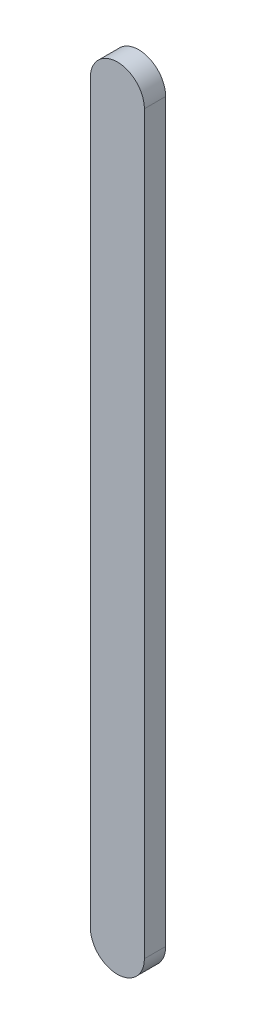
ISO-10303-21;
HEADER;
FILE_DESCRIPTION(('STEP AP214'),'2;1');
FILE_NAME('part.step','',(''),(''),'','','');
FILE_SCHEMA(('AUTOMOTIVE_DESIGN { 1 0 10303 214 1 1 1 1 }'));
ENDSEC;
DATA;
#1=APPLICATION_CONTEXT('core data for automotive mechanical design processes');
#2=APPLICATION_PROTOCOL_DEFINITION('international standard','automotive_design',2000,#1);
#3=PRODUCT_CONTEXT('',#1,'mechanical');
#4=PRODUCT('Part','Part','',(#3));
#5=PRODUCT_RELATED_PRODUCT_CATEGORY('part','',(#4));
#6=PRODUCT_DEFINITION_FORMATION('','',#4);
#7=PRODUCT_DEFINITION_CONTEXT('part definition',#1,'design');
#8=PRODUCT_DEFINITION('design','',#6,#7);
#9=PRODUCT_DEFINITION_SHAPE('','',#8);
#10=(LENGTH_UNIT() NAMED_UNIT(*) SI_UNIT(.MILLI.,.METRE.));
#11=(NAMED_UNIT(*) PLANE_ANGLE_UNIT() SI_UNIT($,.RADIAN.));
#12=(NAMED_UNIT(*) SI_UNIT($,.STERADIAN.) SOLID_ANGLE_UNIT());
#13=UNCERTAINTY_MEASURE_WITH_UNIT(LENGTH_MEASURE(1.E-05),#10,'distance_accuracy_value','');
#14=(GEOMETRIC_REPRESENTATION_CONTEXT(3) GLOBAL_UNCERTAINTY_ASSIGNED_CONTEXT((#13)) GLOBAL_UNIT_ASSIGNED_CONTEXT((#10,
#11,#12)) REPRESENTATION_CONTEXT('',''));
#15=CARTESIAN_POINT('',(0.,0.,0.));
#16=DIRECTION('',(0.,0.,1.));
#17=DIRECTION('',(1.,0.,0.));
#18=AXIS2_PLACEMENT_3D('',#15,#16,#17);
#19=CARTESIAN_POINT('',(96.012,66.86363056,0.));
#20=DIRECTION('',(-1.,0.,0.));
#21=DIRECTION('',(0.,1.,0.));
#22=AXIS2_PLACEMENT_3D('',#19,#20,#21);
#23=PLANE('',#22);
#24=DIRECTION('',(0.,1.,0.));
#25=VECTOR('',#24,1.);
#26=CARTESIAN_POINT('',(96.012,66.86363056,0.1999996));
#27=LINE('',#26,#25);
#28=CARTESIAN_POINT('',(96.012,66.86363056,0.1999996));
#29=VERTEX_POINT('',#28);
#30=CARTESIAN_POINT('',(96.012,73.7840028,0.1999996));
#31=VERTEX_POINT('',#30);
#32=EDGE_CURVE('E11',#29,#31,#27,.T.);
#33=ORIENTED_EDGE('',*,*,#32,.F.);
#34=DIRECTION('',(0.,0.,1.));
#35=VECTOR('',#34,1.);
#36=CARTESIAN_POINT('',(96.012,66.86363056,0.));
#37=LINE('',#36,#35);
#38=CARTESIAN_POINT('',(96.012,66.86363056,0.));
#39=VERTEX_POINT('',#38);
#40=EDGE_CURVE('E24',#39,#29,#37,.T.);
#41=ORIENTED_EDGE('',*,*,#40,.F.);
#42=DIRECTION('',(0.,1.,0.));
#43=VECTOR('',#42,1.);
#44=CARTESIAN_POINT('',(96.012,66.86363056,0.));
#45=LINE('',#44,#43);
#46=CARTESIAN_POINT('',(96.012,73.7840028,0.));
#47=VERTEX_POINT('',#46);
#48=EDGE_CURVE('E75',#39,#47,#45,.T.);
#49=ORIENTED_EDGE('',*,*,#48,.T.);
#50=DIRECTION('',(0.,0.,1.));
#51=VECTOR('',#50,1.);
#52=CARTESIAN_POINT('',(96.012,73.7840028,0.));
#53=LINE('',#52,#51);
#54=EDGE_CURVE('E37',#47,#31,#53,.T.);
#55=ORIENTED_EDGE('',*,*,#54,.T.);
#56=EDGE_LOOP('',(#33,#41,#49,#55));
#57=FACE_BOUND('',#56,.T.);
#58=ADVANCED_FACE('F17',(#57),#23,.F.);
#59=CARTESIAN_POINT('',(95.758,73.7840028,0.));
#60=DIRECTION('',(0.,0.,-1.));
#61=DIRECTION('',(1.,0.,0.));
#62=AXIS2_PLACEMENT_3D('',#59,#60,#61);
#63=CYLINDRICAL_SURFACE('',#62,0.253999999999995);
#64=CARTESIAN_POINT('',(95.758,73.7840028,0.1999996));
#65=DIRECTION('',(0.,0.,1.));
#66=DIRECTION('',(1.,0.,0.));
#67=AXIS2_PLACEMENT_3D('',#64,#65,#66);
#68=CIRCLE('',#67,0.253999999999995);
#69=CARTESIAN_POINT('',(95.504,73.7840028,0.1999996));
#70=VERTEX_POINT('',#69);
#71=EDGE_CURVE('E83',#31,#70,#68,.T.);
#72=ORIENTED_EDGE('',*,*,#71,.F.);
#73=ORIENTED_EDGE('',*,*,#54,.F.);
#74=CARTESIAN_POINT('',(95.758,73.7840028,0.));
#75=DIRECTION('',(0.,0.,1.));
#76=DIRECTION('',(1.,0.,0.));
#77=AXIS2_PLACEMENT_3D('',#74,#75,#76);
#78=CIRCLE('',#77,0.253999999999995);
#79=CARTESIAN_POINT('',(95.504,73.7840028,0.));
#80=VERTEX_POINT('',#79);
#81=EDGE_CURVE('E81',#47,#80,#78,.T.);
#82=ORIENTED_EDGE('',*,*,#81,.T.);
#83=DIRECTION('',(0.,0.,1.));
#84=VECTOR('',#83,1.);
#85=CARTESIAN_POINT('',(95.504,73.7840028,0.));
#86=LINE('',#85,#84);
#87=EDGE_CURVE('E67',#80,#70,#86,.T.);
#88=ORIENTED_EDGE('',*,*,#87,.T.);
#89=EDGE_LOOP('',(#72,#73,#82,#88));
#90=FACE_BOUND('',#89,.T.);
#91=ADVANCED_FACE('F89',(#90),#63,.T.);
#92=CARTESIAN_POINT('',(95.504,73.7840028,0.));
#93=DIRECTION('',(1.,0.,0.));
#94=DIRECTION('',(0.,-1.,0.));
#95=AXIS2_PLACEMENT_3D('',#92,#93,#94);
#96=PLANE('',#95);
#97=DIRECTION('',(0.,-1.,0.));
#98=VECTOR('',#97,1.);
#99=CARTESIAN_POINT('',(95.504,73.7840028,0.1999996));
#100=LINE('',#99,#98);
#101=CARTESIAN_POINT('',(95.504,66.86363056,0.1999996));
#102=VERTEX_POINT('',#101);
#103=EDGE_CURVE('E71',#70,#102,#100,.T.);
#104=ORIENTED_EDGE('',*,*,#103,.F.);
#105=ORIENTED_EDGE('',*,*,#87,.F.);
#106=DIRECTION('',(0.,-1.,0.));
#107=VECTOR('',#106,1.);
#108=CARTESIAN_POINT('',(95.504,73.7840028,0.));
#109=LINE('',#108,#107);
#110=CARTESIAN_POINT('',(95.504,66.86363056,0.));
#111=VERTEX_POINT('',#110);
#112=EDGE_CURVE('E63',#80,#111,#109,.T.);
#113=ORIENTED_EDGE('',*,*,#112,.T.);
#114=DIRECTION('',(0.,0.,1.));
#115=VECTOR('',#114,1.);
#116=CARTESIAN_POINT('',(95.504,66.86363056,0.));
#117=LINE('',#116,#115);
#118=EDGE_CURVE('E53',#111,#102,#117,.T.);
#119=ORIENTED_EDGE('',*,*,#118,.T.);
#120=EDGE_LOOP('',(#104,#105,#113,#119));
#121=FACE_BOUND('',#120,.T.);
#122=ADVANCED_FACE('F66',(#121),#96,.F.);
#123=CARTESIAN_POINT('',(95.758,66.86363056,0.));
#124=DIRECTION('',(0.,0.,-1.));
#125=DIRECTION('',(-1.,0.,0.));
#126=AXIS2_PLACEMENT_3D('',#123,#124,#125);
#127=CYLINDRICAL_SURFACE('',#126,0.253999999999995);
#128=CARTESIAN_POINT('',(95.758,66.86363056,0.1999996));
#129=DIRECTION('',(0.,0.,1.));
#130=DIRECTION('',(-1.,0.,0.));
#131=AXIS2_PLACEMENT_3D('',#128,#129,#130);
#132=CIRCLE('',#131,0.253999999999995);
#133=EDGE_CURVE('E59',#102,#29,#132,.T.);
#134=ORIENTED_EDGE('',*,*,#133,.F.);
#135=ORIENTED_EDGE('',*,*,#118,.F.);
#136=CARTESIAN_POINT('',(95.758,66.86363056,0.));
#137=DIRECTION('',(0.,0.,1.));
#138=DIRECTION('',(-1.,0.,0.));
#139=AXIS2_PLACEMENT_3D('',#136,#137,#138);
#140=CIRCLE('',#139,0.253999999999995);
#141=EDGE_CURVE('E57',#111,#39,#140,.T.);
#142=ORIENTED_EDGE('',*,*,#141,.T.);
#143=ORIENTED_EDGE('',*,*,#40,.T.);
#144=EDGE_LOOP('',(#134,#135,#142,#143));
#145=FACE_BOUND('',#144,.T.);
#146=ADVANCED_FACE('F55',(#145),#127,.T.);
#147=CARTESIAN_POINT('',(96.012,66.86363056,0.));
#148=DIRECTION('',(0.,0.,-1.));
#149=DIRECTION('',(-1.,0.,0.));
#150=AXIS2_PLACEMENT_3D('',#147,#148,#149);
#151=PLANE('',#150);
#152=ORIENTED_EDGE('',*,*,#141,.F.);
#153=ORIENTED_EDGE('',*,*,#112,.F.);
#154=ORIENTED_EDGE('',*,*,#81,.F.);
#155=ORIENTED_EDGE('',*,*,#48,.F.);
#156=EDGE_LOOP('',(#152,#153,#154,#155));
#157=FACE_BOUND('',#156,.T.);
#158=ADVANCED_FACE('F74',(#157),#151,.T.);
#159=CARTESIAN_POINT('',(96.012,66.86363056,0.1999996));
#160=DIRECTION('',(0.,0.,-1.));
#161=DIRECTION('',(-1.,0.,0.));
#162=AXIS2_PLACEMENT_3D('',#159,#160,#161);
#163=PLANE('',#162);
#164=ORIENTED_EDGE('',*,*,#32,.T.);
#165=ORIENTED_EDGE('',*,*,#71,.T.);
#166=ORIENTED_EDGE('',*,*,#103,.T.);
#167=ORIENTED_EDGE('',*,*,#133,.T.);
#168=EDGE_LOOP('',(#164,#165,#166,#167));
#169=FACE_BOUND('',#168,.T.);
#170=ADVANCED_FACE('F91',(#169),#163,.F.);
#171=CLOSED_SHELL('',(#58,#91,#122,#146,#158,#170));
#172=MANIFOLD_SOLID_BREP('B1',#171);
#173=ADVANCED_BREP_SHAPE_REPRESENTATION('',(#18,#172),#14);
#174=SHAPE_DEFINITION_REPRESENTATION(#9,#173);
ENDSEC;
END-ISO-10303-21;
